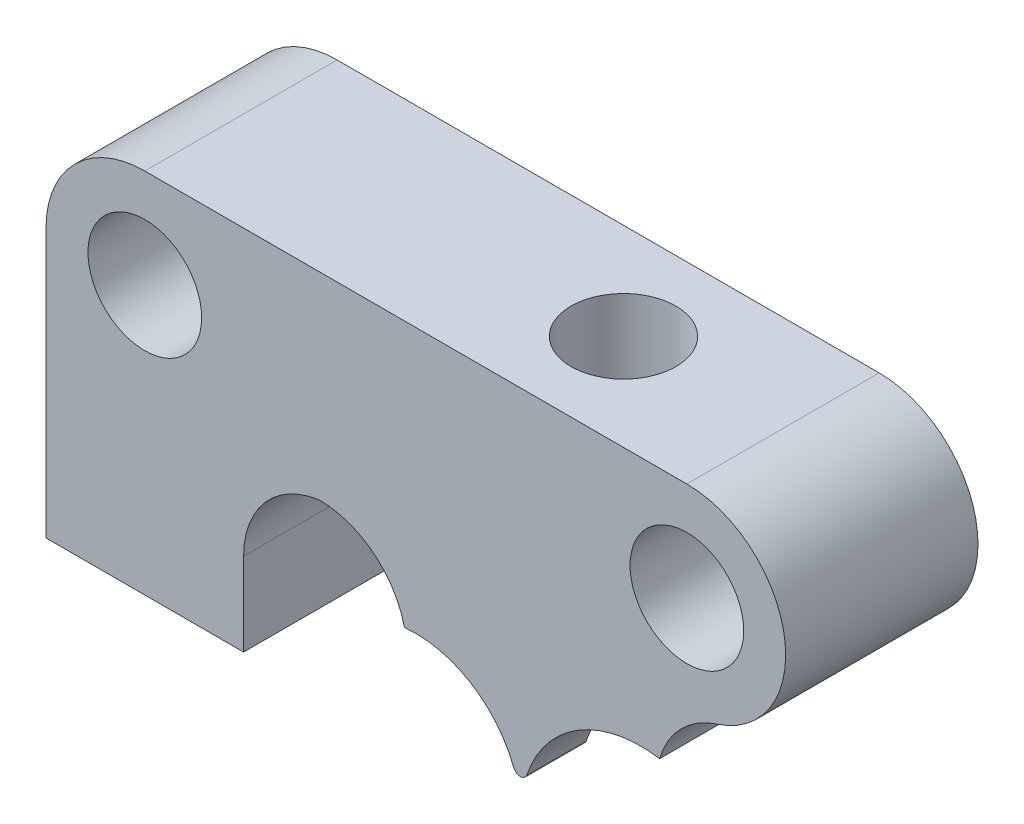
ISO-10303-21;
HEADER;
FILE_DESCRIPTION(('STEP AP214'),'2;1');
FILE_NAME('part.step','',(''),(''),'','','');
FILE_SCHEMA(('AUTOMOTIVE_DESIGN { 1 0 10303 214 1 1 1 1 }'));
ENDSEC;
DATA;
#1=APPLICATION_CONTEXT('core data for automotive mechanical design processes');
#2=APPLICATION_PROTOCOL_DEFINITION('international standard','automotive_design',2000,#1);
#3=PRODUCT_CONTEXT('',#1,'mechanical');
#4=PRODUCT('Part','Part','',(#3));
#5=PRODUCT_RELATED_PRODUCT_CATEGORY('part','',(#4));
#6=PRODUCT_DEFINITION_FORMATION('','',#4);
#7=PRODUCT_DEFINITION_CONTEXT('part definition',#1,'design');
#8=PRODUCT_DEFINITION('design','',#6,#7);
#9=PRODUCT_DEFINITION_SHAPE('','',#8);
#10=(LENGTH_UNIT() NAMED_UNIT(*) SI_UNIT(.MILLI.,.METRE.));
#11=(NAMED_UNIT(*) PLANE_ANGLE_UNIT() SI_UNIT($,.RADIAN.));
#12=(NAMED_UNIT(*) SI_UNIT($,.STERADIAN.) SOLID_ANGLE_UNIT());
#13=UNCERTAINTY_MEASURE_WITH_UNIT(LENGTH_MEASURE(1.E-05),#10,'distance_accuracy_value','');
#14=(GEOMETRIC_REPRESENTATION_CONTEXT(3) GLOBAL_UNCERTAINTY_ASSIGNED_CONTEXT((#13)) GLOBAL_UNIT_ASSIGNED_CONTEXT((#10,
#11,#12)) REPRESENTATION_CONTEXT('',''));
#15=CARTESIAN_POINT('',(0.,0.,0.));
#16=DIRECTION('',(0.,0.,1.));
#17=DIRECTION('',(1.,0.,0.));
#18=AXIS2_PLACEMENT_3D('',#15,#16,#17);
#19=CARTESIAN_POINT('',(15.5,0.,-5.5));
#20=DIRECTION('',(0.,0.,1.));
#21=DIRECTION('',(1.,0.,0.));
#22=AXIS2_PLACEMENT_3D('',#19,#20,#21);
#23=CYLINDRICAL_SURFACE('',#22,1.6);
#24=CARTESIAN_POINT('',(15.5,0.,-5.5));
#25=DIRECTION('',(0.,0.,1.));
#26=DIRECTION('',(-1.,0.,0.));
#27=AXIS2_PLACEMENT_3D('',#24,#25,#26);
#28=CIRCLE('',#27,1.6);
#29=CARTESIAN_POINT('',(13.9,0.,-5.5));
#30=VERTEX_POINT('',#29);
#31=EDGE_CURVE('E172',#30,#30,#28,.T.);
#32=ORIENTED_EDGE('',*,*,#31,.F.);
#33=EDGE_LOOP('',(#32));
#34=FACE_BOUND('',#33,.T.);
#35=CARTESIAN_POINT('',(15.5,0.,-2.5));
#36=DIRECTION('',(0.,0.,1.));
#37=DIRECTION('',(1.,0.,0.));
#38=AXIS2_PLACEMENT_3D('',#35,#36,#37);
#39=CIRCLE('',#38,1.6);
#40=CARTESIAN_POINT('',(17.1,0.,-2.5));
#41=VERTEX_POINT('',#40);
#42=EDGE_CURVE('E372',#41,#41,#39,.F.);
#43=ORIENTED_EDGE('',*,*,#42,.F.);
#44=EDGE_LOOP('',(#43));
#45=FACE_BOUND('',#44,.T.);
#46=ADVANCED_FACE('F35',(#34,#45),#23,.F.);
#47=CARTESIAN_POINT('',(-15.5,0.,-5.5));
#48=DIRECTION('',(0.,0.,1.));
#49=DIRECTION('',(1.,0.,0.));
#50=AXIS2_PLACEMENT_3D('',#47,#48,#49);
#51=CYLINDRICAL_SURFACE('',#50,1.6);
#52=CARTESIAN_POINT('',(-15.5,0.,-5.5));
#53=DIRECTION('',(0.,0.,1.));
#54=DIRECTION('',(1.,0.,0.));
#55=AXIS2_PLACEMENT_3D('',#52,#53,#54);
#56=CIRCLE('',#55,1.6);
#57=CARTESIAN_POINT('',(-13.9,0.,-5.5));
#58=VERTEX_POINT('',#57);
#59=EDGE_CURVE('E175',#58,#58,#56,.T.);
#60=ORIENTED_EDGE('',*,*,#59,.F.);
#61=EDGE_LOOP('',(#60));
#62=FACE_BOUND('',#61,.T.);
#63=CARTESIAN_POINT('',(-15.5,0.,-2.5));
#64=DIRECTION('',(0.,0.,1.));
#65=DIRECTION('',(1.,0.,0.));
#66=AXIS2_PLACEMENT_3D('',#63,#64,#65);
#67=CIRCLE('',#66,1.6);
#68=CARTESIAN_POINT('',(-13.9,0.,-2.5));
#69=VERTEX_POINT('',#68);
#70=EDGE_CURVE('E378',#69,#69,#67,.F.);
#71=ORIENTED_EDGE('',*,*,#70,.F.);
#72=EDGE_LOOP('',(#71));
#73=FACE_BOUND('',#72,.T.);
#74=ADVANCED_FACE('F271',(#62,#73),#51,.F.);
#75=CARTESIAN_POINT('',(5.97354085603113,-13.2028692589827,-23.103006673446));
#76=DIRECTION('',(0.,0.,1.));
#77=DIRECTION('',(1.,0.,0.));
#78=AXIS2_PLACEMENT_3D('',#75,#76,#77);
#79=CYLINDRICAL_SURFACE('',#78,0.4);
#80=CARTESIAN_POINT('',(5.60019455252918,-13.3464399302962,-1.95183926555686));
#81=CARTESIAN_POINT('',(5.608347715772,-13.3676811915095,-1.95507330052211));
#82=CARTESIAN_POINT('',(5.61829181817849,-13.388097082791,-1.95896476773846));
#83=CARTESIAN_POINT('',(5.64132435827622,-13.426776079711,-1.96770762235598));
#84=CARTESIAN_POINT('',(5.65440475108509,-13.4450445179356,-1.97255654825818));
#85=CARTESIAN_POINT('',(5.68330032621506,-13.4790183336808,-1.98287301812496));
#86=CARTESIAN_POINT('',(5.69911216958106,-13.4947267955079,-1.98833980402227));
#87=CARTESIAN_POINT('',(5.73306411015345,-13.5232799607954,-1.99955947295355));
#88=CARTESIAN_POINT('',(5.75120559950401,-13.536122939242,-2.00531252578478));
#89=CARTESIAN_POINT('',(5.79012642435731,-13.5590849058018,-2.0170154431616));
#90=CARTESIAN_POINT('',(5.81098170591194,-13.5690760828936,-2.02296409348674));
#91=CARTESIAN_POINT('',(5.8541853327466,-13.5853440208873,-2.03451510498206));
#92=CARTESIAN_POINT('',(5.87653363736439,-13.591620882902,-2.04011747557511));
#93=CARTESIAN_POINT('',(5.92213240931326,-13.6002300890079,-2.05072152260191));
#94=CARTESIAN_POINT('',(5.94538333109942,-13.6025604190215,-2.05572289111074));
#95=CARTESIAN_POINT('',(5.99209128503104,-13.6031204117898,-2.06493270002383));
#96=CARTESIAN_POINT('',(6.01554827080366,-13.6013509747446,-2.06914131427646));
#97=CARTESIAN_POINT('',(6.0611179422559,-13.5938231144565,-2.07653381085748));
#98=CARTESIAN_POINT('',(6.08324899175528,-13.5882057997674,-2.07974828356291));
#99=CARTESIAN_POINT('',(6.12632313147857,-13.573243498962,-2.08533727500704));
#100=CARTESIAN_POINT('',(6.14726648382025,-13.5638993390239,-2.08771197968806));
#101=CARTESIAN_POINT('',(6.1867607967648,-13.5420345074817,-2.09163808329146));
#102=CARTESIAN_POINT('',(6.20536112004586,-13.5296065181265,-2.09321000004595));
#103=CARTESIAN_POINT('',(6.24026345493022,-13.5017956585147,-2.09574638563841));
#104=CARTESIAN_POINT('',(6.25656456623487,-13.4864116363085,-2.09671061703575));
#105=CARTESIAN_POINT('',(6.28634406737617,-13.4531716909248,-2.09818070041755));
#106=CARTESIAN_POINT('',(6.29982916983322,-13.4353218185931,-2.09868765224675));
#107=CARTESIAN_POINT('',(6.32362098195122,-13.3976470108319,-2.09940538330142));
#108=CARTESIAN_POINT('',(6.33393347421165,-13.3778257569148,-2.09961670388799));
#109=CARTESIAN_POINT('',(6.34633717478432,-13.3482010832342,-2.09980753365186));
#110=CARTESIAN_POINT('',(6.34981014774181,-13.3389600473704,-2.09985060186055));
#111=CARTESIAN_POINT('',(6.35293170535355,-13.3296075067629,-2.09988404212504));
#112=B_SPLINE_CURVE_WITH_KNOTS('',3,(#80,#81,#82,#83,#84,#85,#86,#87,#88,#89,#90,#91,#92,#93,
#94,#95,#96,#97,#98,#99,#100,#101,#102,#103,#104,#105,#106,#107,#108,#109,#110,#111),
.UNSPECIFIED.,.F.,.F.,(4,2,2,2,2,2,2,2,2,2,2,2,2,2,2,4),(0.,0.0688020749817213,
0.137429519420797,0.205973659003121,0.274558951312234,0.345856575247001,0.417152258193158,
0.488484315305642,0.559800711276562,0.628632713045664,0.697449464402272,0.764406209252077,
0.831389099887829,0.898210450933966,0.964909277569956,0.994496744066015),.UNSPECIFIED.);
#113=CARTESIAN_POINT('',(5.60019455252918,-13.3464399302962,-1.95183926555686));
#114=VERTEX_POINT('',#113);
#115=CARTESIAN_POINT('',(6.35293170535355,-13.3296075067629,-2.09988404212504));
#116=VERTEX_POINT('',#115);
#117=EDGE_CURVE('E245',#114,#116,#112,.T.);
#118=ORIENTED_EDGE('',*,*,#117,.F.);
#119=DIRECTION('',(0.,0.,1.));
#120=VECTOR('',#119,1.);
#121=CARTESIAN_POINT('',(5.60019455252918,-13.3464399302962,-23.103006673446));
#122=LINE('',#121,#120);
#123=CARTESIAN_POINT('',(5.60019455252918,-13.3464399302962,-5.5));
#124=VERTEX_POINT('',#123);
#125=EDGE_CURVE('E190',#124,#114,#122,.T.);
#126=ORIENTED_EDGE('',*,*,#125,.F.);
#127=CARTESIAN_POINT('',(5.97354085603113,-13.2028692589827,-5.5));
#128=DIRECTION('',(0.,0.,1.));
#129=DIRECTION('',(1.,0.,0.));
#130=AXIS2_PLACEMENT_3D('',#127,#128,#129);
#131=CIRCLE('',#130,0.4);
#132=CARTESIAN_POINT('',(6.35293170535355,-13.3296075067629,-5.5));
#133=VERTEX_POINT('',#132);
#134=EDGE_CURVE('E199',#133,#124,#131,.F.);
#135=ORIENTED_EDGE('',*,*,#134,.F.);
#136=DIRECTION('',(0.,0.,1.));
#137=VECTOR('',#136,1.);
#138=CARTESIAN_POINT('',(6.35293170535355,-13.3296075067629,-23.103006673446));
#139=LINE('',#138,#137);
#140=EDGE_CURVE('E195',#116,#133,#139,.F.);
#141=ORIENTED_EDGE('',*,*,#140,.F.);
#142=EDGE_LOOP('',(#118,#126,#135,#141));
#143=FACE_BOUND('',#142,.T.);
#144=ADVANCED_FACE('F275',(#143),#79,.T.);
#145=CARTESIAN_POINT('',(-15.5,0.,-5.5));
#146=DIRECTION('',(0.,0.,1.));
#147=DIRECTION('',(1.,0.,0.));
#148=AXIS2_PLACEMENT_3D('',#145,#146,#147);
#149=CYLINDRICAL_SURFACE('',#148,5.65);
#150=DIRECTION('',(0.,0.,1.));
#151=VECTOR('',#150,1.);
#152=CARTESIAN_POINT('',(-21.15,0.,-24.5607581171369));
#153=LINE('',#152,#151);
#154=CARTESIAN_POINT('',(-21.15,0.,-5.5));
#155=VERTEX_POINT('',#154);
#156=CARTESIAN_POINT('',(-21.15,0.,5.5));
#157=VERTEX_POINT('',#156);
#158=EDGE_CURVE('E138',#155,#157,#153,.T.);
#159=ORIENTED_EDGE('',*,*,#158,.T.);
#160=CARTESIAN_POINT('',(-15.5,0.,5.5));
#161=DIRECTION('',(0.,0.,1.));
#162=DIRECTION('',(1.,0.,0.));
#163=AXIS2_PLACEMENT_3D('',#160,#161,#162);
#164=CIRCLE('',#163,5.65);
#165=CARTESIAN_POINT('',(-15.5,5.65,5.5));
#166=VERTEX_POINT('',#165);
#167=EDGE_CURVE('E152',#166,#157,#164,.T.);
#168=ORIENTED_EDGE('',*,*,#167,.F.);
#169=DIRECTION('',(0.,0.,1.));
#170=VECTOR('',#169,1.);
#171=CARTESIAN_POINT('',(-15.5,5.65,-5.5));
#172=LINE('',#171,#170);
#173=CARTESIAN_POINT('',(-15.5,5.65,-5.5));
#174=VERTEX_POINT('',#173);
#175=EDGE_CURVE('E185',#174,#166,#172,.T.);
#176=ORIENTED_EDGE('',*,*,#175,.F.);
#177=CARTESIAN_POINT('',(-15.5,0.,-5.5));
#178=DIRECTION('',(0.,0.,1.));
#179=DIRECTION('',(1.,0.,0.));
#180=AXIS2_PLACEMENT_3D('',#177,#178,#179);
#181=CIRCLE('',#180,5.65);
#182=EDGE_CURVE('E154',#174,#155,#181,.T.);
#183=ORIENTED_EDGE('',*,*,#182,.T.);
#184=EDGE_LOOP('',(#159,#168,#176,#183));
#185=FACE_BOUND('',#184,.T.);
#186=ADVANCED_FACE('F151',(#185),#149,.T.);
#187=CARTESIAN_POINT('',(-15.5,5.65,-5.5));
#188=DIRECTION('',(0.,1.,0.));
#189=DIRECTION('',(-1.,0.,0.));
#190=AXIS2_PLACEMENT_3D('',#187,#188,#189);
#191=PLANE('',#190);
#192=CARTESIAN_POINT('',(6.375,5.65,0.));
#193=DIRECTION('',(0.,1.,0.));
#194=DIRECTION('',(-1.,0.,0.));
#195=AXIS2_PLACEMENT_3D('',#192,#193,#194);
#196=CIRCLE('',#195,3.);
#197=CARTESIAN_POINT('',(3.375,5.65,0.));
#198=VERTEX_POINT('',#197);
#199=EDGE_CURVE('E167',#198,#198,#196,.T.);
#200=ORIENTED_EDGE('',*,*,#199,.F.);
#201=EDGE_LOOP('',(#200));
#202=FACE_BOUND('',#201,.T.);
#203=ORIENTED_EDGE('',*,*,#175,.T.);
#204=DIRECTION('',(-1.,0.,0.));
#205=VECTOR('',#204,1.);
#206=CARTESIAN_POINT('',(-15.5,5.65,5.5));
#207=LINE('',#206,#205);
#208=CARTESIAN_POINT('',(15.5,5.65,5.5));
#209=VERTEX_POINT('',#208);
#210=EDGE_CURVE('E161',#209,#166,#207,.T.);
#211=ORIENTED_EDGE('',*,*,#210,.F.);
#212=DIRECTION('',(0.,0.,1.));
#213=VECTOR('',#212,1.);
#214=CARTESIAN_POINT('',(15.5,5.65,-5.5));
#215=LINE('',#214,#213);
#216=CARTESIAN_POINT('',(15.5,5.65,-5.5));
#217=VERTEX_POINT('',#216);
#218=EDGE_CURVE('E184',#217,#209,#215,.T.);
#219=ORIENTED_EDGE('',*,*,#218,.F.);
#220=DIRECTION('',(-1.,0.,0.));
#221=VECTOR('',#220,1.);
#222=CARTESIAN_POINT('',(-15.5,5.65,-5.5));
#223=LINE('',#222,#221);
#224=EDGE_CURVE('E181',#217,#174,#223,.T.);
#225=ORIENTED_EDGE('',*,*,#224,.T.);
#226=EDGE_LOOP('',(#203,#211,#219,#225));
#227=FACE_BOUND('',#226,.T.);
#228=ADVANCED_FACE('F280',(#202,#227),#191,.T.);
#229=CARTESIAN_POINT('',(15.5,0.,-5.5));
#230=DIRECTION('',(0.,0.,1.));
#231=DIRECTION('',(1.,0.,0.));
#232=AXIS2_PLACEMENT_3D('',#229,#230,#231);
#233=CYLINDRICAL_SURFACE('',#232,5.65);
#234=CARTESIAN_POINT('',(15.5,0.,5.5));
#235=DIRECTION('',(0.,0.,1.));
#236=DIRECTION('',(1.,0.,0.));
#237=AXIS2_PLACEMENT_3D('',#234,#235,#236);
#238=CIRCLE('',#237,5.65);
#239=CARTESIAN_POINT('',(17.2169144549984,-5.38281569015858,5.5));
#240=VERTEX_POINT('',#239);
#241=EDGE_CURVE('E162',#240,#209,#238,.T.);
#242=ORIENTED_EDGE('',*,*,#241,.F.);
#243=DIRECTION('',(0.,0.,1.));
#244=VECTOR('',#243,1.);
#245=CARTESIAN_POINT('',(17.2169144549984,-5.38281569015859,-5.5));
#246=LINE('',#245,#244);
#247=CARTESIAN_POINT('',(17.2169144549984,-5.38281569015858,-5.5));
#248=VERTEX_POINT('',#247);
#249=EDGE_CURVE('E213',#240,#248,#246,.F.);
#250=ORIENTED_EDGE('',*,*,#249,.T.);
#251=CARTESIAN_POINT('',(15.5,0.,-5.5));
#252=DIRECTION('',(0.,0.,1.));
#253=DIRECTION('',(1.,0.,0.));
#254=AXIS2_PLACEMENT_3D('',#251,#252,#253);
#255=CIRCLE('',#254,5.65);
#256=EDGE_CURVE('E179',#248,#217,#255,.T.);
#257=ORIENTED_EDGE('',*,*,#256,.T.);
#258=ORIENTED_EDGE('',*,*,#218,.T.);
#259=EDGE_LOOP('',(#242,#250,#257,#258));
#260=FACE_BOUND('',#259,.T.);
#261=ADVANCED_FACE('F279',(#260),#233,.T.);
#262=CARTESIAN_POINT('',(-15.5,0.,-5.5));
#263=DIRECTION('',(0.,0.,1.));
#264=DIRECTION('',(1.,0.,0.));
#265=AXIS2_PLACEMENT_3D('',#262,#263,#264);
#266=PLANE('',#265);
#267=DIRECTION('',(0.,1.,0.));
#268=VECTOR('',#267,1.);
#269=CARTESIAN_POINT('',(-21.15,0.,-5.5));
#270=LINE('',#269,#268);
#271=CARTESIAN_POINT('',(-21.15,-15.35,-5.5));
#272=VERTEX_POINT('',#271);
#273=EDGE_CURVE('E349',#272,#155,#270,.T.);
#274=ORIENTED_EDGE('',*,*,#273,.T.);
#275=ORIENTED_EDGE('',*,*,#182,.F.);
#276=ORIENTED_EDGE('',*,*,#224,.F.);
#277=ORIENTED_EDGE('',*,*,#256,.F.);
#278=CARTESIAN_POINT('',(18.7363077780059,-10.1463693982635,-5.5));
#279=DIRECTION('',(0.,0.,1.));
#280=DIRECTION('',(1.,0.,0.));
#281=AXIS2_PLACEMENT_3D('',#278,#279,#280);
#282=CIRCLE('',#281,5.);
#283=CARTESIAN_POINT('',(13.9390151945711,-8.73711999914288,-5.5));
#284=VERTEX_POINT('',#283);
#285=EDGE_CURVE('E401',#248,#284,#282,.T.);
#286=ORIENTED_EDGE('',*,*,#285,.T.);
#287=CARTESIAN_POINT('',(12.85,-15.5,-5.5));
#288=DIRECTION('',(0.,0.,1.));
#289=DIRECTION('',(1.,0.,0.));
#290=AXIS2_PLACEMENT_3D('',#287,#288,#289);
#291=CIRCLE('',#290,6.85);
#292=EDGE_CURVE('E331',#284,#133,#291,.T.);
#293=ORIENTED_EDGE('',*,*,#292,.T.);
#294=ORIENTED_EDGE('',*,*,#134,.T.);
#295=CARTESIAN_POINT('',(0.,-15.5,-5.5));
#296=DIRECTION('',(0.,0.,1.));
#297=DIRECTION('',(1.,0.,0.));
#298=AXIS2_PLACEMENT_3D('',#295,#296,#297);
#299=CIRCLE('',#298,6.);
#300=CARTESIAN_POINT('',(-0.650136389581505,-9.53532711081807,-5.5));
#301=VERTEX_POINT('',#300);
#302=EDGE_CURVE('E329',#124,#301,#299,.T.);
#303=ORIENTED_EDGE('',*,*,#302,.T.);
#304=CARTESIAN_POINT('',(-5.52430343125363,-10.65,-5.5));
#305=DIRECTION('',(0.,0.,1.));
#306=DIRECTION('',(1.,0.,0.));
#307=AXIS2_PLACEMENT_3D('',#304,#305,#306);
#308=CIRCLE('',#307,5.);
#309=CARTESIAN_POINT('',(-5.52430343125363,-5.65,-5.5));
#310=VERTEX_POINT('',#309);
#311=EDGE_CURVE('E387',#301,#310,#308,.T.);
#312=ORIENTED_EDGE('',*,*,#311,.T.);
#313=CARTESIAN_POINT('',(-4.84999999999999,-10.6043228480388,-5.5));
#314=DIRECTION('',(0.,0.,1.));
#315=DIRECTION('',(1.,0.,0.));
#316=AXIS2_PLACEMENT_3D('',#313,#314,#315);
#317=CIRCLE('',#316,5.);
#318=CARTESIAN_POINT('',(-9.84999999999999,-10.6043228480388,-5.5));
#319=VERTEX_POINT('',#318);
#320=EDGE_CURVE('E12',#310,#319,#317,.T.);
#321=ORIENTED_EDGE('',*,*,#320,.T.);
#322=DIRECTION('',(0.,-1.,0.));
#323=VECTOR('',#322,1.);
#324=CARTESIAN_POINT('',(-9.84999999999999,0.,-5.5));
#325=LINE('',#324,#323);
#326=CARTESIAN_POINT('',(-9.84999999999999,-15.35,-5.5));
#327=VERTEX_POINT('',#326);
#328=EDGE_CURVE('E354',#319,#327,#325,.T.);
#329=ORIENTED_EDGE('',*,*,#328,.T.);
#330=DIRECTION('',(-1.,0.,0.));
#331=VECTOR('',#330,1.);
#332=CARTESIAN_POINT('',(0.,-15.35,-5.5));
#333=LINE('',#332,#331);
#334=EDGE_CURVE('E351',#327,#272,#333,.T.);
#335=ORIENTED_EDGE('',*,*,#334,.T.);
#336=EDGE_LOOP('',(#274,#275,#276,#277,#286,#293,#294,#303,#312,#321,#329,#335));
#337=FACE_BOUND('',#336,.T.);
#338=ORIENTED_EDGE('',*,*,#31,.T.);
#339=EDGE_LOOP('',(#338));
#340=FACE_BOUND('',#339,.T.);
#341=ORIENTED_EDGE('',*,*,#59,.T.);
#342=EDGE_LOOP('',(#341));
#343=FACE_BOUND('',#342,.T.);
#344=ADVANCED_FACE('F267',(#337,#340,#343),#266,.F.);
#345=CARTESIAN_POINT('',(-15.5,0.,5.5));
#346=DIRECTION('',(0.,0.,1.));
#347=DIRECTION('',(1.,0.,0.));
#348=AXIS2_PLACEMENT_3D('',#345,#346,#347);
#349=PLANE('',#348);
#350=CARTESIAN_POINT('',(15.5,0.,5.5));
#351=DIRECTION('',(0.,0.,1.));
#352=DIRECTION('',(1.,0.,0.));
#353=AXIS2_PLACEMENT_3D('',#350,#351,#352);
#354=CIRCLE('',#353,3.25);
#355=CARTESIAN_POINT('',(18.75,0.,5.5));
#356=VERTEX_POINT('',#355);
#357=EDGE_CURVE('E361',#356,#356,#354,.T.);
#358=ORIENTED_EDGE('',*,*,#357,.F.);
#359=EDGE_LOOP('',(#358));
#360=FACE_BOUND('',#359,.T.);
#361=CARTESIAN_POINT('',(-15.5,0.,5.5));
#362=DIRECTION('',(0.,0.,1.));
#363=DIRECTION('',(1.,0.,0.));
#364=AXIS2_PLACEMENT_3D('',#361,#362,#363);
#365=CIRCLE('',#364,3.25);
#366=CARTESIAN_POINT('',(-12.25,0.,5.5));
#367=VERTEX_POINT('',#366);
#368=EDGE_CURVE('E373',#367,#367,#365,.T.);
#369=ORIENTED_EDGE('',*,*,#368,.F.);
#370=EDGE_LOOP('',(#369));
#371=FACE_BOUND('',#370,.T.);
#372=CARTESIAN_POINT('',(0.,-15.5,5.5));
#373=DIRECTION('',(0.,0.,-1.));
#374=DIRECTION('',(-1.,0.,0.));
#375=AXIS2_PLACEMENT_3D('',#372,#373,#374);
#376=CIRCLE('',#375,6.);
#377=CARTESIAN_POINT('',(-0.650136389581505,-9.53532711081807,5.5));
#378=VERTEX_POINT('',#377);
#379=CARTESIAN_POINT('',(5.60019455252918,-13.3464399302962,5.5));
#380=VERTEX_POINT('',#379);
#381=EDGE_CURVE('E320',#378,#380,#376,.T.);
#382=ORIENTED_EDGE('',*,*,#381,.T.);
#383=CARTESIAN_POINT('',(5.97354085603113,-13.2028692589827,5.5));
#384=DIRECTION('',(0.,0.,1.));
#385=DIRECTION('',(1.,0.,0.));
#386=AXIS2_PLACEMENT_3D('',#383,#384,#385);
#387=CIRCLE('',#386,0.4);
#388=CARTESIAN_POINT('',(6.35293170535355,-13.3296075067629,5.5));
#389=VERTEX_POINT('',#388);
#390=EDGE_CURVE('E193',#380,#389,#387,.T.);
#391=ORIENTED_EDGE('',*,*,#390,.T.);
#392=CARTESIAN_POINT('',(12.85,-15.5,5.5));
#393=DIRECTION('',(0.,0.,-1.));
#394=DIRECTION('',(-1.,0.,0.));
#395=AXIS2_PLACEMENT_3D('',#392,#393,#394);
#396=CIRCLE('',#395,6.85);
#397=CARTESIAN_POINT('',(13.9390151945711,-8.73711999914288,5.5));
#398=VERTEX_POINT('',#397);
#399=EDGE_CURVE('E316',#389,#398,#396,.T.);
#400=ORIENTED_EDGE('',*,*,#399,.T.);
#401=CARTESIAN_POINT('',(18.7363077780059,-10.1463693982635,5.5));
#402=DIRECTION('',(0.,0.,1.));
#403=DIRECTION('',(1.,0.,0.));
#404=AXIS2_PLACEMENT_3D('',#401,#402,#403);
#405=CIRCLE('',#404,5.);
#406=EDGE_CURVE('E402',#398,#240,#405,.F.);
#407=ORIENTED_EDGE('',*,*,#406,.T.);
#408=ORIENTED_EDGE('',*,*,#241,.T.);
#409=ORIENTED_EDGE('',*,*,#210,.T.);
#410=ORIENTED_EDGE('',*,*,#167,.T.);
#411=DIRECTION('',(0.,-1.,0.));
#412=VECTOR('',#411,1.);
#413=CARTESIAN_POINT('',(-21.15,0.,5.5));
#414=LINE('',#413,#412);
#415=CARTESIAN_POINT('',(-21.15,-15.35,5.5));
#416=VERTEX_POINT('',#415);
#417=EDGE_CURVE('E134',#157,#416,#414,.T.);
#418=ORIENTED_EDGE('',*,*,#417,.T.);
#419=DIRECTION('',(1.,0.,0.));
#420=VECTOR('',#419,1.);
#421=CARTESIAN_POINT('',(0.,-15.35,5.5));
#422=LINE('',#421,#420);
#423=CARTESIAN_POINT('',(-9.84999999999999,-15.35,5.5));
#424=VERTEX_POINT('',#423);
#425=EDGE_CURVE('E146',#416,#424,#422,.T.);
#426=ORIENTED_EDGE('',*,*,#425,.T.);
#427=DIRECTION('',(0.,1.,0.));
#428=VECTOR('',#427,1.);
#429=CARTESIAN_POINT('',(-9.84999999999999,0.,5.5));
#430=LINE('',#429,#428);
#431=CARTESIAN_POINT('',(-9.84999999999999,-10.6043228480388,5.5));
#432=VERTEX_POINT('',#431);
#433=EDGE_CURVE('E155',#424,#432,#430,.T.);
#434=ORIENTED_EDGE('',*,*,#433,.T.);
#435=CARTESIAN_POINT('',(-4.84999999999999,-10.6043228480388,5.5));
#436=DIRECTION('',(0.,0.,1.));
#437=DIRECTION('',(1.,0.,0.));
#438=AXIS2_PLACEMENT_3D('',#435,#436,#437);
#439=CIRCLE('',#438,5.);
#440=CARTESIAN_POINT('',(-5.52430343125363,-5.65,5.5));
#441=VERTEX_POINT('',#440);
#442=EDGE_CURVE('E43',#432,#441,#439,.F.);
#443=ORIENTED_EDGE('',*,*,#442,.T.);
#444=CARTESIAN_POINT('',(-5.52430343125363,-10.65,5.5));
#445=DIRECTION('',(0.,0.,1.));
#446=DIRECTION('',(1.,0.,0.));
#447=AXIS2_PLACEMENT_3D('',#444,#445,#446);
#448=CIRCLE('',#447,5.);
#449=EDGE_CURVE('E393',#441,#378,#448,.F.);
#450=ORIENTED_EDGE('',*,*,#449,.T.);
#451=EDGE_LOOP('',(#382,#391,#400,#407,#408,#409,#410,#418,#426,#434,#443,#450));
#452=FACE_BOUND('',#451,.T.);
#453=ADVANCED_FACE('F159',(#360,#371,#452),#349,.T.);
#454=CARTESIAN_POINT('',(6.375,0.65,0.));
#455=DIRECTION('',(0.,1.,0.));
#456=DIRECTION('',(-1.,0.,0.));
#457=AXIS2_PLACEMENT_3D('',#454,#455,#456);
#458=CYLINDRICAL_SURFACE('',#457,3.);
#459=CARTESIAN_POINT('',(6.375,0.65,0.));
#460=DIRECTION('',(0.,1.,0.));
#461=DIRECTION('',(-1.,0.,0.));
#462=AXIS2_PLACEMENT_3D('',#459,#460,#461);
#463=CIRCLE('',#462,3.);
#464=CARTESIAN_POINT('',(3.375,0.65,0.));
#465=VERTEX_POINT('',#464);
#466=EDGE_CURVE('E163',#465,#465,#463,.T.);
#467=ORIENTED_EDGE('',*,*,#466,.F.);
#468=EDGE_LOOP('',(#467));
#469=FACE_BOUND('',#468,.T.);
#470=ORIENTED_EDGE('',*,*,#199,.T.);
#471=EDGE_LOOP('',(#470));
#472=FACE_BOUND('',#471,.T.);
#473=ADVANCED_FACE('F260',(#469,#472),#458,.F.);
#474=CARTESIAN_POINT('',(6.375,0.65,0.));
#475=DIRECTION('',(0.,1.,0.));
#476=DIRECTION('',(-1.,0.,0.));
#477=AXIS2_PLACEMENT_3D('',#474,#475,#476);
#478=PLANE('',#477);
#479=CARTESIAN_POINT('',(6.375,0.65,0.));
#480=DIRECTION('',(0.,1.,0.));
#481=DIRECTION('',(-1.,0.,0.));
#482=AXIS2_PLACEMENT_3D('',#479,#480,#481);
#483=CIRCLE('',#482,0.95);
#484=CARTESIAN_POINT('',(5.425,0.649999999999999,0.));
#485=VERTEX_POINT('',#484);
#486=EDGE_CURVE('E324',#485,#485,#483,.T.);
#487=ORIENTED_EDGE('',*,*,#486,.F.);
#488=EDGE_LOOP('',(#487));
#489=FACE_BOUND('',#488,.T.);
#490=ORIENTED_EDGE('',*,*,#466,.T.);
#491=EDGE_LOOP('',(#490));
#492=FACE_BOUND('',#491,.T.);
#493=ADVANCED_FACE('F255',(#489,#492),#478,.T.);
#494=CARTESIAN_POINT('',(0.,-15.5,-23.103006673446));
#495=DIRECTION('',(0.,0.,1.));
#496=DIRECTION('',(1.,0.,0.));
#497=AXIS2_PLACEMENT_3D('',#494,#495,#496);
#498=CYLINDRICAL_SURFACE('',#497,6.);
#499=CARTESIAN_POINT('',(5.60019455252918,-13.3464399302962,1.95183926555686));
#500=CARTESIAN_POINT('',(5.5807249600577,-13.295808987317,1.94410823472759));
#501=CARTESIAN_POINT('',(5.5605988670132,-13.2455241752105,1.93578429885447));
#502=CARTESIAN_POINT('',(5.51908025838827,-13.1457112963829,1.917789130673));
#503=CARTESIAN_POINT('',(5.49768745672673,-13.0961834038113,1.9081175933417));
#504=CARTESIAN_POINT('',(5.43152898561603,-12.9485008854855,1.87676731811303));
#505=CARTESIAN_POINT('',(5.3849288154,-12.8516252242922,1.8528080124504));
#506=CARTESIAN_POINT('',(5.28683667334973,-12.6608048555584,1.79697855573533));
#507=CARTESIAN_POINT('',(5.23528329891555,-12.5669234523681,1.76499818585172));
#508=CARTESIAN_POINT('',(5.12907283148057,-12.3849262456802,1.69169146794275));
#509=CARTESIAN_POINT('',(5.07442177815938,-12.2967998977817,1.65038286791067));
#510=CARTESIAN_POINT('',(4.96009220807071,-12.1222756056204,1.55370150125076));
#511=CARTESIAN_POINT('',(4.900313571287,-12.036334246376,1.49760808319254));
#512=CARTESIAN_POINT('',(4.78222206932678,-11.8750478379493,1.37130508551637));
#513=CARTESIAN_POINT('',(4.72390342200975,-11.799652539798,1.30116660933404));
#514=CARTESIAN_POINT('',(4.62081139716186,-11.6719696905705,1.15733702563733));
#515=CARTESIAN_POINT('',(4.57531729083565,-11.6179125153812,1.08575000771934));
#516=CARTESIAN_POINT('',(4.49101418042913,-11.5206859771638,0.931819360601692));
#517=CARTESIAN_POINT('',(4.45220898499471,-11.4775228107017,0.849469649765282));
#518=CARTESIAN_POINT('',(4.38417430729011,-11.4034667337416,0.674867778221855));
#519=CARTESIAN_POINT('',(4.35501818435943,-11.3726674625213,0.58254652896732));
#520=CARTESIAN_POINT('',(4.30945915460723,-11.3251140149703,0.391365495523074));
#521=CARTESIAN_POINT('',(4.29304533618556,-11.3083478207502,0.292511384512188));
#522=CARTESIAN_POINT('',(4.2758658256634,-11.2908326800376,0.105833516663206));
#523=CARTESIAN_POINT('',(4.27326932514139,-11.2882090893397,0.018346942429282));
#524=CARTESIAN_POINT('',(4.27898311550852,-11.2940133994065,-0.155880339820197));
#525=CARTESIAN_POINT('',(4.28728939654763,-11.3024372371218,-0.242621310248155));
#526=CARTESIAN_POINT('',(4.31352195759299,-11.3294060943775,-0.408722479496125));
#527=CARTESIAN_POINT('',(4.33098134965716,-11.3474605880607,-0.488238221009338));
#528=CARTESIAN_POINT('',(4.37402070682487,-11.3928215461766,-0.642244701618418));
#529=CARTESIAN_POINT('',(4.39960135283205,-11.4201287863928,-0.716735018736553));
#530=CARTESIAN_POINT('',(4.4589271135698,-11.4850285484386,-0.863286613604367));
#531=CARTESIAN_POINT('',(4.49305129986278,-11.523114251242,-0.934974011467418));
#532=CARTESIAN_POINT('',(4.56651820949985,-11.6076926315508,-1.07019999719645));
#533=CARTESIAN_POINT('',(4.60586311532634,-11.6541888279683,-1.1337351551104));
#534=CARTESIAN_POINT('',(4.70654141428023,-11.7774586850735,-1.27956649149858));
#535=CARTESIAN_POINT('',(4.76969441387106,-11.8583479696922,-1.35713351040969));
#536=CARTESIAN_POINT('',(4.89767033514051,-12.0323581843029,-1.49547234475733));
#537=CARTESIAN_POINT('',(4.96249709920114,-12.1255097328298,-1.55620089520809));
#538=CARTESIAN_POINT('',(5.07321721166418,-12.2953300408542,-1.64897255314107));
#539=CARTESIAN_POINT('',(5.11961119807032,-12.3699016259358,-1.68436050035696));
#540=CARTESIAN_POINT('',(5.21025437483633,-12.5232270606301,-1.74826959328712));
#541=CARTESIAN_POINT('',(5.25450227230737,-12.6019833728679,-1.77678663975106));
#542=CARTESIAN_POINT('',(5.34008141674755,-12.7628771918096,-1.82795752960625));
#543=CARTESIAN_POINT('',(5.38141267870065,-12.8450146811397,-1.85061140312063));
#544=CARTESIAN_POINT('',(5.46064407511862,-13.0120478945966,-1.891012919249));
#545=CARTESIAN_POINT('',(5.49854578674289,-13.0969423262186,-1.90876282485879));
#546=CARTESIAN_POINT('',(5.54588756606664,-13.2100233330899,-1.92943628123288));
#547=CARTESIAN_POINT('',(5.55702676197155,-13.2371880289352,-1.93418206102943));
#548=CARTESIAN_POINT('',(5.57890561804872,-13.291681237829,-1.94328950164357));
#549=CARTESIAN_POINT('',(5.58964598864224,-13.3190093478828,-1.94765186646368));
#550=CARTESIAN_POINT('',(5.60019455252919,-13.3464399302962,-1.95183926555698));
#551=B_SPLINE_CURVE_WITH_KNOTS('',3,(#499,#500,#501,#502,#503,#504,#505,#506,#507,#508,#509,
#510,#511,#512,#513,#514,#515,#516,#517,#518,#519,#520,#521,#522,#523,#524,#525,#526,#527,#528,
#529,#530,#531,#532,#533,#534,#535,#536,#537,#538,#539,#540,#541,#542,#543,#544,#545,#546,#547,
#548,#549,#550),.UNSPECIFIED.,.F.,.F.,(4,2,2,2,2,2,2,2,2,2,2,2,2,2,2,2,2,2,2,2,2,2,2,2,2,4),(0.,
0.164364375966333,0.328766015617755,0.658792030163756,0.993628537643197,1.32783327025367,
1.68303872430693,2.0364894460765,2.33702210080343,2.637725316677,2.94066481750665,
3.24334461553571,3.50469058025461,3.76594045348154,4.01500204814372,4.26408453019062,
4.52721368541281,4.7904531883985,5.17421844889587,5.55896081145088,5.84264683069398,
6.12650168316235,6.4103550772454,6.69407726409867,6.78329671443823,6.87234876533797),.UNSPECIFIED.);
#552=CARTESIAN_POINT('',(5.60019455252918,-13.3464399302962,1.95183926555686));
#553=VERTEX_POINT('',#552);
#554=EDGE_CURVE('E240',#553,#114,#551,.T.);
#555=ORIENTED_EDGE('',*,*,#554,.F.);
#556=EDGE_CURVE('E187',#553,#380,#122,.T.);
#557=ORIENTED_EDGE('',*,*,#556,.T.);
#558=ORIENTED_EDGE('',*,*,#381,.F.);
#559=DIRECTION('',(0.,0.,1.));
#560=VECTOR('',#559,1.);
#561=CARTESIAN_POINT('',(-0.650136389581505,-9.53532711081807,-23.103006673446));
#562=LINE('',#561,#560);
#563=EDGE_CURVE('E322',#301,#378,#562,.T.);
#564=ORIENTED_EDGE('',*,*,#563,.F.);
#565=ORIENTED_EDGE('',*,*,#302,.F.);
#566=ORIENTED_EDGE('',*,*,#125,.T.);
#567=EDGE_LOOP('',(#555,#557,#558,#564,#565,#566));
#568=FACE_BOUND('',#567,.T.);
#569=ADVANCED_FACE('F250',(#568),#498,.F.);
#570=CARTESIAN_POINT('',(12.85,-15.5,-23.103006673446));
#571=DIRECTION('',(0.,0.,1.));
#572=DIRECTION('',(1.,0.,0.));
#573=AXIS2_PLACEMENT_3D('',#570,#571,#572);
#574=CYLINDRICAL_SURFACE('',#573,6.85);
#575=CARTESIAN_POINT('',(6.35293170535355,-13.3296075067629,-2.09988404212504));
#576=CARTESIAN_POINT('',(6.37907714246061,-13.2513420600247,-2.1001540865466));
#577=CARTESIAN_POINT('',(6.40663491436668,-13.1735544343757,-2.09996053664631));
#578=CARTESIAN_POINT('',(6.46454495020782,-13.019016529654,-2.09829093787775));
#579=CARTESIAN_POINT('',(6.49489799459971,-12.942266547199,-2.0968145298513));
#580=CARTESIAN_POINT('',(6.59042812311099,-12.7129291399987,-2.08990269397807));
#581=CARTESIAN_POINT('',(6.659789879042,-12.5621116976914,-2.08197384000479));
#582=CARTESIAN_POINT('',(6.81010395530011,-12.2641932615521,-2.05587035042508));
#583=CARTESIAN_POINT('',(6.89122408786063,-12.1171904494171,-2.03753368433504));
#584=CARTESIAN_POINT('',(7.06266554391648,-11.8316470918069,-1.98622697333508));
#585=CARTESIAN_POINT('',(7.15295961421007,-11.6930833305733,-1.95329934801217));
#586=CARTESIAN_POINT('',(7.28575959153987,-11.5042002021428,-1.89271421052346));
#587=CARTESIAN_POINT('',(7.32557312128558,-11.4493559662832,-1.87309687424775));
#588=CARTESIAN_POINT('',(7.40604764857712,-11.3418282199533,-1.83003411515653));
#589=CARTESIAN_POINT('',(7.44670870532059,-11.2891448611826,-1.80658842415316));
#590=CARTESIAN_POINT('',(7.56915017265795,-11.1351149812838,-1.73010328817965));
#591=CARTESIAN_POINT('',(7.65169552398453,-11.037355878562,-1.6707841955009));
#592=CARTESIAN_POINT('',(7.81581171011341,-10.8529737867917,-1.53158292170029));
#593=CARTESIAN_POINT('',(7.8973524938521,-10.7665268295589,-1.45142316942318));
#594=CARTESIAN_POINT('',(8.0131684138548,-10.6491619259568,-1.31527964396456));
#595=CARTESIAN_POINT('',(8.05068601164168,-10.6120958740083,-1.26725625651603));
#596=CARTESIAN_POINT('',(8.12266896736819,-10.5424465612498,-1.16598041299126));
#597=CARTESIAN_POINT('',(8.15713583708244,-10.5098610756338,-1.11273057476297));
#598=CARTESIAN_POINT('',(8.23441882444715,-10.4381176950171,-0.980035480357506));
#599=CARTESIAN_POINT('',(8.27544196104817,-10.4011560867039,-0.898316197050816));
#600=CARTESIAN_POINT('',(8.34739600677849,-10.3375024110092,-0.726837973833774));
#601=CARTESIAN_POINT('',(8.37833142257528,-10.310805756824,-0.637082646913772));
#602=CARTESIAN_POINT('',(8.42816964496319,-10.2682692914031,-0.45140216084568));
#603=CARTESIAN_POINT('',(8.44702532225906,-10.252471985937,-0.35545442419338));
#604=CARTESIAN_POINT('',(8.47113994651157,-10.2323305005004,-0.160683439923067));
#605=CARTESIAN_POINT('',(8.47640155995381,-10.2279840744283,-0.0618607600736364));
#606=CARTESIAN_POINT('',(8.47307181338638,-10.2307501023127,0.128691107766412));
#607=CARTESIAN_POINT('',(8.4653905055555,-10.2371097541223,0.220449344253559));
#608=CARTESIAN_POINT('',(8.43838515731881,-10.2597270349996,0.400958527412137));
#609=CARTESIAN_POINT('',(8.41906272308273,-10.275983298598,0.489709887169614));
#610=CARTESIAN_POINT('',(8.36996579371859,-10.3180286553653,0.661918805981577));
#611=CARTESIAN_POINT('',(8.34018606380657,-10.3438225232761,0.74537368893927));
#612=CARTESIAN_POINT('',(8.27191289340316,-10.4043457056194,0.905138852445));
#613=CARTESIAN_POINT('',(8.23341773403348,-10.439076782855,0.981447719435958));
#614=CARTESIAN_POINT('',(8.14638996764601,-10.5198060783369,1.13149817223893));
#615=CARTESIAN_POINT('',(8.09730179673697,-10.566481825629,1.20455003198533));
#616=CARTESIAN_POINT('',(7.99389901961156,-10.6682235926323,1.34032268023582));
#617=CARTESIAN_POINT('',(7.93958171719835,-10.7232939493246,1.40303809347137));
#618=CARTESIAN_POINT('',(7.80046839004312,-10.8697442285521,1.54673631253296));
#619=CARTESIAN_POINT('',(7.71388130256221,-10.9656140803649,1.62141946204768));
#620=CARTESIAN_POINT('',(7.54039794297219,-11.1700236600358,1.75031387963923));
#621=CARTESIAN_POINT('',(7.45350141033635,-11.2785908986059,1.80447957657772));
#622=CARTESIAN_POINT('',(7.30468678521586,-11.4771410762038,1.88439018783228));
#623=CARTESIAN_POINT('',(7.24192016753157,-11.5650524041755,1.91385218970349));
#624=CARTESIAN_POINT('',(7.11961226496615,-11.7453992855724,1.96467371920782));
#625=CARTESIAN_POINT('',(7.06007286932278,-11.837837430029,1.98602854383515));
#626=CARTESIAN_POINT('',(6.9448696712301,-12.0266435882005,2.02210309603636));
#627=CARTESIAN_POINT('',(6.88921598661669,-12.1230208959635,2.03680601076482));
#628=CARTESIAN_POINT('',(6.7824459313063,-12.3188480455121,2.06082004712277));
#629=CARTESIAN_POINT('',(6.73132836558992,-12.4182970687059,2.0701325924118));
#630=CARTESIAN_POINT('',(6.61898278122795,-12.6507369279724,2.08677223929883));
#631=CARTESIAN_POINT('',(6.5594607278721,-12.7846623501637,2.09261497509409));
#632=CARTESIAN_POINT('',(6.47690260558508,-12.9877445041018,2.09770467386792));
#633=CARTESIAN_POINT('',(6.45058662960667,-13.0555569008655,2.09879144027849));
#634=CARTESIAN_POINT('',(6.40012534377627,-13.191991394043,2.1000008978348));
#635=CARTESIAN_POINT('',(6.37597997091712,-13.2606134668883,2.10012361697336));
#636=CARTESIAN_POINT('',(6.35293170535355,-13.3296075067629,2.09988404212504));
#637=B_SPLINE_CURVE_WITH_KNOTS('',3,(#575,#576,#577,#578,#579,#580,#581,#582,#583,#584,#585,
#586,#587,#588,#589,#590,#591,#592,#593,#594,#595,#596,#597,#598,#599,#600,#601,#602,#603,#604,
#605,#606,#607,#608,#609,#610,#611,#612,#613,#614,#615,#616,#617,#618,#619,#620,#621,#622,#623,
#624,#625,#626,#627,#628,#629,#630,#631,#632,#633,#634,#635,#636),.UNSPECIFIED.,.F.,.F.,(4,2,2,
2,2,2,2,2,2,2,2,2,2,2,2,2,2,2,2,2,2,2,2,2,2,2,2,2,2,2,4),(0.,0.247520516696163,
0.495110353351539,0.992994379765745,1.498850916893,2.00324635325428,2.21478641860069,
2.42634130933331,2.84782482733905,3.27523843103634,3.48888083206079,3.70241676379289,
3.99696072211277,4.29137291270245,4.58692687221299,4.88242285419466,5.15799647137053,
5.43353207532885,5.70920580585535,5.98493395286289,6.28264498754831,6.5805103559023,
7.02565017684422,7.47177297616175,7.8072168772774,8.14285507446871,8.47933692893193,
8.81572987400845,9.25527035284775,9.47347940562091,9.69168212228678),.UNSPECIFIED.);
#638=CARTESIAN_POINT('',(6.35293170535355,-13.3296075067629,2.09988404212504));
#639=VERTEX_POINT('',#638);
#640=EDGE_CURVE('E205',#116,#639,#637,.T.);
#641=ORIENTED_EDGE('',*,*,#640,.F.);
#642=ORIENTED_EDGE('',*,*,#140,.T.);
#643=ORIENTED_EDGE('',*,*,#292,.F.);
#644=DIRECTION('',(0.,0.,1.));
#645=VECTOR('',#644,1.);
#646=CARTESIAN_POINT('',(13.9390151945711,-8.73711999914288,-23.103006673446));
#647=LINE('',#646,#645);
#648=EDGE_CURVE('E319',#284,#398,#647,.T.);
#649=ORIENTED_EDGE('',*,*,#648,.T.);
#650=ORIENTED_EDGE('',*,*,#399,.F.);
#651=EDGE_CURVE('E196',#389,#639,#139,.F.);
#652=ORIENTED_EDGE('',*,*,#651,.T.);
#653=EDGE_LOOP('',(#641,#642,#643,#649,#650,#652));
#654=FACE_BOUND('',#653,.T.);
#655=ADVANCED_FACE('F254',(#654),#574,.F.);
#656=CARTESIAN_POINT('',(6.35293170535355,-13.3296075067629,2.09988404212504));
#657=CARTESIAN_POINT('',(6.3458445340523,-13.3508843794541,2.09980438396467));
#658=CARTESIAN_POINT('',(6.33693411280312,-13.3715474683532,2.09968027808138));
#659=CARTESIAN_POINT('',(6.31580157912601,-13.4110895303678,2.09919333864354));
#660=CARTESIAN_POINT('',(6.30358103251168,-13.4299693413601,2.0988306178472));
#661=CARTESIAN_POINT('',(6.2761471892012,-13.4654204763664,2.09771647693716));
#662=CARTESIAN_POINT('',(6.26093203106645,-13.481990353535,2.09696481458311));
#663=CARTESIAN_POINT('',(6.22796996357857,-13.5123318727186,2.09491159551496));
#664=CARTESIAN_POINT('',(6.21022391997309,-13.526104467719,2.09361022654324));
#665=CARTESIAN_POINT('',(6.17281458852653,-13.5504109746416,2.09032802328737));
#666=CARTESIAN_POINT('',(6.15316082001035,-13.5609599774719,2.08835044981213));
#667=CARTESIAN_POINT('',(6.11245224862724,-13.5786298707302,2.08362381912577));
#668=CARTESIAN_POINT('',(6.09139725368087,-13.5857502900634,2.08087465597864));
#669=CARTESIAN_POINT('',(6.04855148974262,-13.5963916728996,2.07458409925645));
#670=CARTESIAN_POINT('',(6.02676203626247,-13.5999187519325,2.07104406423711));
#671=CARTESIAN_POINT('',(5.9830360505968,-13.6033576374552,2.06321537704059));
#672=CARTESIAN_POINT('',(5.96109951464405,-13.6032693509879,2.05892670561753));
#673=CARTESIAN_POINT('',(5.91725317186479,-13.5995115090463,2.049629140446));
#674=CARTESIAN_POINT('',(5.89535182571194,-13.5957738011918,2.04460808886369));
#675=CARTESIAN_POINT('',(5.85257031812003,-13.5847778984342,2.03409758455647));
#676=CARTESIAN_POINT('',(5.83169032144952,-13.577519137548,2.02860805664441));
#677=CARTESIAN_POINT('',(5.79073318784253,-13.5593812459662,2.01720111128056));
#678=CARTESIAN_POINT('',(5.77071164865363,-13.5483816813853,2.01127540955539));
#679=CARTESIAN_POINT('',(5.73279922531454,-13.5231232459158,1.99949320255531));
#680=CARTESIAN_POINT('',(5.71490975702277,-13.5088622273156,1.99363674556359));
#681=CARTESIAN_POINT('',(5.68142680169703,-13.4771176057188,1.98223993884715));
#682=CARTESIAN_POINT('',(5.6658844301805,-13.4595769942435,1.97670789678212));
#683=CARTESIAN_POINT('',(5.6380364586008,-13.4219179384215,1.96649577582992));
#684=CARTESIAN_POINT('',(5.6257232884896,-13.4018056904535,1.96181371246564));
#685=CARTESIAN_POINT('',(5.6097026941405,-13.3695378306127,1.95559560355767));
#686=CARTESIAN_POINT('',(5.60467639762853,-13.3581068709444,1.95361766836237));
#687=CARTESIAN_POINT('',(5.60019455252917,-13.3464399302962,1.95183926555686));
#688=B_SPLINE_CURVE_WITH_KNOTS('',3,(#656,#657,#658,#659,#660,#661,#662,#663,#664,#665,#666,
#667,#668,#669,#670,#671,#672,#673,#674,#675,#676,#677,#678,#679,#680,#681,#682,#683,#684,#685,
#686,#687),.UNSPECIFIED.,.F.,.F.,(4,2,2,2,2,2,2,2,2,2,2,2,2,2,2,4),(0.,0.0671922181710152,
0.134352707240901,0.201555075605503,0.268734510746204,0.335594456465263,0.402463586267331,
0.469218719971181,0.535975570061362,0.604003415051858,0.672042198639015,0.742519574544968,
0.813043495078565,0.884931818901677,0.956650081034027,0.994520591935837),.UNSPECIFIED.);
#689=EDGE_CURVE('E201',#639,#553,#688,.T.);
#690=ORIENTED_EDGE('',*,*,#689,.F.);
#691=ORIENTED_EDGE('',*,*,#651,.F.);
#692=ORIENTED_EDGE('',*,*,#390,.F.);
#693=ORIENTED_EDGE('',*,*,#556,.F.);
#694=EDGE_LOOP('',(#690,#691,#692,#693));
#695=FACE_BOUND('',#694,.T.);
#696=ADVANCED_FACE('F215',(#695),#79,.T.);
#697=CARTESIAN_POINT('',(6.375,-13.6028692589827,0.));
#698=DIRECTION('',(0.,1.,0.));
#699=DIRECTION('',(-1.,0.,0.));
#700=AXIS2_PLACEMENT_3D('',#697,#698,#699);
#701=CYLINDRICAL_SURFACE('',#700,0.95);
#702=CARTESIAN_POINT('',(6.375,-3.32960750676292,0.));
#703=DIRECTION('',(0.,1.,0.));
#704=DIRECTION('',(-1.,0.,0.));
#705=AXIS2_PLACEMENT_3D('',#702,#703,#704);
#706=CIRCLE('',#705,0.95);
#707=CARTESIAN_POINT('',(5.425,-3.32960750676292,0.));
#708=VERTEX_POINT('',#707);
#709=EDGE_CURVE('E202',#708,#708,#706,.F.);
#710=ORIENTED_EDGE('',*,*,#709,.T.);
#711=EDGE_LOOP('',(#710));
#712=FACE_BOUND('',#711,.T.);
#713=ORIENTED_EDGE('',*,*,#486,.T.);
#714=EDGE_LOOP('',(#713));
#715=FACE_BOUND('',#714,.T.);
#716=ADVANCED_FACE('F228',(#712,#715),#701,.F.);
#717=CARTESIAN_POINT('',(6.375,-3.32960750676292,0.));
#718=DIRECTION('',(0.,1.,0.));
#719=DIRECTION('',(-1.,0.,0.));
#720=AXIS2_PLACEMENT_3D('',#717,#718,#719);
#721=PLANE('',#720);
#722=CARTESIAN_POINT('',(6.375,-3.32960750676292,0.));
#723=DIRECTION('',(0.,1.,0.));
#724=DIRECTION('',(-1.,0.,0.));
#725=AXIS2_PLACEMENT_3D('',#722,#723,#724);
#726=CIRCLE('',#725,2.1);
#727=CARTESIAN_POINT('',(4.275,-3.32960750676292,0.));
#728=VERTEX_POINT('',#727);
#729=EDGE_CURVE('E206',#728,#728,#726,.T.);
#730=ORIENTED_EDGE('',*,*,#729,.F.);
#731=EDGE_LOOP('',(#730));
#732=FACE_BOUND('',#731,.T.);
#733=ORIENTED_EDGE('',*,*,#709,.F.);
#734=EDGE_LOOP('',(#733));
#735=FACE_BOUND('',#734,.T.);
#736=ADVANCED_FACE('F225',(#732,#735),#721,.F.);
#737=CARTESIAN_POINT('',(6.375,-13.6028692589827,0.));
#738=DIRECTION('',(0.,1.,0.));
#739=DIRECTION('',(-1.,0.,0.));
#740=AXIS2_PLACEMENT_3D('',#737,#738,#739);
#741=CYLINDRICAL_SURFACE('',#740,2.1);
#742=ORIENTED_EDGE('',*,*,#117,.T.);
#743=ORIENTED_EDGE('',*,*,#640,.T.);
#744=ORIENTED_EDGE('',*,*,#689,.T.);
#745=ORIENTED_EDGE('',*,*,#554,.T.);
#746=EDGE_LOOP('',(#742,#743,#744,#745));
#747=FACE_BOUND('',#746,.T.);
#748=ORIENTED_EDGE('',*,*,#729,.T.);
#749=EDGE_LOOP('',(#748));
#750=FACE_BOUND('',#749,.T.);
#751=ADVANCED_FACE('F219',(#747,#750),#741,.F.);
#752=CARTESIAN_POINT('',(18.7363077780059,-10.1463693982635,-5.5));
#753=DIRECTION('',(0.,0.,-1.));
#754=DIRECTION('',(-1.,0.,0.));
#755=AXIS2_PLACEMENT_3D('',#752,#753,#754);
#756=CYLINDRICAL_SURFACE('',#755,5.);
#757=ORIENTED_EDGE('',*,*,#285,.F.);
#758=ORIENTED_EDGE('',*,*,#249,.F.);
#759=ORIENTED_EDGE('',*,*,#406,.F.);
#760=ORIENTED_EDGE('',*,*,#648,.F.);
#761=EDGE_LOOP('',(#757,#758,#759,#760));
#762=FACE_BOUND('',#761,.T.);
#763=ADVANCED_FACE('F224',(#762),#756,.F.);
#764=CARTESIAN_POINT('',(-5.52430343125363,-10.65,-23.103006673446));
#765=DIRECTION('',(0.,0.,1.));
#766=DIRECTION('',(1.,0.,0.));
#767=AXIS2_PLACEMENT_3D('',#764,#765,#766);
#768=CYLINDRICAL_SURFACE('',#767,5.);
#769=ORIENTED_EDGE('',*,*,#311,.F.);
#770=ORIENTED_EDGE('',*,*,#563,.T.);
#771=ORIENTED_EDGE('',*,*,#449,.F.);
#772=DIRECTION('',(0.,0.,-1.));
#773=VECTOR('',#772,1.);
#774=CARTESIAN_POINT('',(-5.52430343125363,-5.65,5.5));
#775=LINE('',#774,#773);
#776=EDGE_CURVE('E400',#310,#441,#775,.F.);
#777=ORIENTED_EDGE('',*,*,#776,.F.);
#778=EDGE_LOOP('',(#769,#770,#771,#777));
#779=FACE_BOUND('',#778,.T.);
#780=ADVANCED_FACE('F399',(#779),#768,.F.);
#781=CARTESIAN_POINT('',(-15.5,0.,-2.5));
#782=DIRECTION('',(0.,0.,1.));
#783=DIRECTION('',(1.,0.,0.));
#784=AXIS2_PLACEMENT_3D('',#781,#782,#783);
#785=PLANE('',#784);
#786=CARTESIAN_POINT('',(-15.5,0.,-2.5));
#787=DIRECTION('',(0.,0.,1.));
#788=DIRECTION('',(1.,0.,0.));
#789=AXIS2_PLACEMENT_3D('',#786,#787,#788);
#790=CIRCLE('',#789,3.25);
#791=CARTESIAN_POINT('',(-12.25,0.,-2.5));
#792=VERTEX_POINT('',#791);
#793=EDGE_CURVE('E376',#792,#792,#790,.F.);
#794=ORIENTED_EDGE('',*,*,#793,.F.);
#795=EDGE_LOOP('',(#794));
#796=FACE_BOUND('',#795,.T.);
#797=ORIENTED_EDGE('',*,*,#70,.T.);
#798=EDGE_LOOP('',(#797));
#799=FACE_BOUND('',#798,.T.);
#800=ADVANCED_FACE('F414',(#796,#799),#785,.T.);
#801=CARTESIAN_POINT('',(-15.5,0.,-14.6923881554251));
#802=DIRECTION('',(0.,0.,1.));
#803=DIRECTION('',(1.,0.,0.));
#804=AXIS2_PLACEMENT_3D('',#801,#802,#803);
#805=CYLINDRICAL_SURFACE('',#804,3.25);
#806=ORIENTED_EDGE('',*,*,#793,.T.);
#807=EDGE_LOOP('',(#806));
#808=FACE_BOUND('',#807,.T.);
#809=ORIENTED_EDGE('',*,*,#368,.T.);
#810=EDGE_LOOP('',(#809));
#811=FACE_BOUND('',#810,.T.);
#812=ADVANCED_FACE('F419',(#808,#811),#805,.F.);
#813=CARTESIAN_POINT('',(-15.5,0.,-2.5));
#814=DIRECTION('',(0.,0.,1.));
#815=DIRECTION('',(1.,0.,0.));
#816=AXIS2_PLACEMENT_3D('',#813,#814,#815);
#817=PLANE('',#816);
#818=CARTESIAN_POINT('',(15.5,0.,-2.5));
#819=DIRECTION('',(0.,0.,1.));
#820=DIRECTION('',(1.,0.,0.));
#821=AXIS2_PLACEMENT_3D('',#818,#819,#820);
#822=CIRCLE('',#821,3.25);
#823=CARTESIAN_POINT('',(18.75,0.,-2.5));
#824=VERTEX_POINT('',#823);
#825=EDGE_CURVE('E369',#824,#824,#822,.F.);
#826=ORIENTED_EDGE('',*,*,#825,.F.);
#827=EDGE_LOOP('',(#826));
#828=FACE_BOUND('',#827,.T.);
#829=ORIENTED_EDGE('',*,*,#42,.T.);
#830=EDGE_LOOP('',(#829));
#831=FACE_BOUND('',#830,.T.);
#832=ADVANCED_FACE('F426',(#828,#831),#817,.T.);
#833=CARTESIAN_POINT('',(15.5,0.,-14.6923881554251));
#834=DIRECTION('',(0.,0.,1.));
#835=DIRECTION('',(1.,0.,0.));
#836=AXIS2_PLACEMENT_3D('',#833,#834,#835);
#837=CYLINDRICAL_SURFACE('',#836,3.25);
#838=ORIENTED_EDGE('',*,*,#825,.T.);
#839=EDGE_LOOP('',(#838));
#840=FACE_BOUND('',#839,.T.);
#841=ORIENTED_EDGE('',*,*,#357,.T.);
#842=EDGE_LOOP('',(#841));
#843=FACE_BOUND('',#842,.T.);
#844=ADVANCED_FACE('F430',(#840,#843),#837,.F.);
#845=CARTESIAN_POINT('',(-21.15,0.,-24.5607581171369));
#846=DIRECTION('',(-1.,0.,0.));
#847=DIRECTION('',(0.,0.,1.));
#848=AXIS2_PLACEMENT_3D('',#845,#846,#847);
#849=PLANE('',#848);
#850=ORIENTED_EDGE('',*,*,#273,.F.);
#851=DIRECTION('',(0.,0.,1.));
#852=VECTOR('',#851,1.);
#853=CARTESIAN_POINT('',(-21.15,-15.35,-24.5607581171369));
#854=LINE('',#853,#852);
#855=EDGE_CURVE('E141',#272,#416,#854,.T.);
#856=ORIENTED_EDGE('',*,*,#855,.T.);
#857=ORIENTED_EDGE('',*,*,#417,.F.);
#858=ORIENTED_EDGE('',*,*,#158,.F.);
#859=EDGE_LOOP('',(#850,#856,#857,#858));
#860=FACE_BOUND('',#859,.T.);
#861=ADVANCED_FACE('F137',(#860),#849,.T.);
#862=CARTESIAN_POINT('',(0.,-15.35,-24.5607581171369));
#863=DIRECTION('',(0.,-1.,0.));
#864=DIRECTION('',(0.,0.,-1.));
#865=AXIS2_PLACEMENT_3D('',#862,#863,#864);
#866=PLANE('',#865);
#867=CARTESIAN_POINT('',(-15.5,-15.35,0.));
#868=DIRECTION('',(0.,-1.,0.));
#869=DIRECTION('',(0.,0.,-1.));
#870=AXIS2_PLACEMENT_3D('',#867,#868,#869);
#871=CIRCLE('',#870,3.7);
#872=CARTESIAN_POINT('',(-15.5,-15.35,-3.7));
#873=VERTEX_POINT('',#872);
#874=EDGE_CURVE('E358',#873,#873,#871,.T.);
#875=ORIENTED_EDGE('',*,*,#874,.F.);
#876=EDGE_LOOP('',(#875));
#877=FACE_BOUND('',#876,.T.);
#878=ORIENTED_EDGE('',*,*,#334,.F.);
#879=DIRECTION('',(0.,0.,1.));
#880=VECTOR('',#879,1.);
#881=CARTESIAN_POINT('',(-9.84999999999999,-15.35,-24.5607581171369));
#882=LINE('',#881,#880);
#883=EDGE_CURVE('E352',#327,#424,#882,.T.);
#884=ORIENTED_EDGE('',*,*,#883,.T.);
#885=ORIENTED_EDGE('',*,*,#425,.F.);
#886=ORIENTED_EDGE('',*,*,#855,.F.);
#887=EDGE_LOOP('',(#878,#884,#885,#886));
#888=FACE_BOUND('',#887,.T.);
#889=ADVANCED_FACE('F439',(#877,#888),#866,.T.);
#890=CARTESIAN_POINT('',(-9.84999999999999,0.,-24.5607581171369));
#891=DIRECTION('',(1.,0.,0.));
#892=DIRECTION('',(0.,0.,-1.));
#893=AXIS2_PLACEMENT_3D('',#890,#891,#892);
#894=PLANE('',#893);
#895=ORIENTED_EDGE('',*,*,#328,.F.);
#896=DIRECTION('',(0.,0.,1.));
#897=VECTOR('',#896,1.);
#898=CARTESIAN_POINT('',(-9.84999999999999,-10.6043228480388,5.5));
#899=LINE('',#898,#897);
#900=EDGE_CURVE('E391',#319,#432,#899,.T.);
#901=ORIENTED_EDGE('',*,*,#900,.T.);
#902=ORIENTED_EDGE('',*,*,#433,.F.);
#903=ORIENTED_EDGE('',*,*,#883,.F.);
#904=EDGE_LOOP('',(#895,#901,#902,#903));
#905=FACE_BOUND('',#904,.T.);
#906=ADVANCED_FACE('F442',(#905),#894,.T.);
#907=CARTESIAN_POINT('',(-15.5,-12.35,0.));
#908=DIRECTION('',(0.,-1.,0.));
#909=DIRECTION('',(0.,0.,-1.));
#910=AXIS2_PLACEMENT_3D('',#907,#908,#909);
#911=CYLINDRICAL_SURFACE('',#910,3.7);
#912=CARTESIAN_POINT('',(-15.5,-12.35,0.));
#913=DIRECTION('',(0.,-1.,0.));
#914=DIRECTION('',(0.,0.,-1.));
#915=AXIS2_PLACEMENT_3D('',#912,#913,#914);
#916=CIRCLE('',#915,3.7);
#917=CARTESIAN_POINT('',(-15.5,-12.35,-3.7));
#918=VERTEX_POINT('',#917);
#919=EDGE_CURVE('E147',#918,#918,#916,.T.);
#920=ORIENTED_EDGE('',*,*,#919,.F.);
#921=EDGE_LOOP('',(#920));
#922=FACE_BOUND('',#921,.T.);
#923=ORIENTED_EDGE('',*,*,#874,.T.);
#924=EDGE_LOOP('',(#923));
#925=FACE_BOUND('',#924,.T.);
#926=ADVANCED_FACE('F446',(#922,#925),#911,.F.);
#927=CARTESIAN_POINT('',(-15.5,-12.35,0.));
#928=DIRECTION('',(0.,-1.,0.));
#929=DIRECTION('',(0.,0.,-1.));
#930=AXIS2_PLACEMENT_3D('',#927,#928,#929);
#931=PLANE('',#930);
#932=ORIENTED_EDGE('',*,*,#919,.T.);
#933=EDGE_LOOP('',(#932));
#934=FACE_BOUND('',#933,.T.);
#935=ADVANCED_FACE('F450',(#934),#931,.T.);
#936=CARTESIAN_POINT('',(-4.84999999999999,-10.6043228480388,-5.5));
#937=DIRECTION('',(0.,0.,-1.));
#938=DIRECTION('',(-1.,0.,0.));
#939=AXIS2_PLACEMENT_3D('',#936,#937,#938);
#940=CYLINDRICAL_SURFACE('',#939,5.);
#941=ORIENTED_EDGE('',*,*,#320,.F.);
#942=ORIENTED_EDGE('',*,*,#776,.T.);
#943=ORIENTED_EDGE('',*,*,#442,.F.);
#944=ORIENTED_EDGE('',*,*,#900,.F.);
#945=EDGE_LOOP('',(#941,#942,#943,#944));
#946=FACE_BOUND('',#945,.T.);
#947=ADVANCED_FACE('F37',(#946),#940,.F.);
#948=CLOSED_SHELL('',(#46,#74,#144,#186,#228,#261,#344,#453,#473,#493,#569,#655,#696,#716,#736,
#751,#763,#780,#800,#812,#832,#844,#861,#889,#906,#926,#935,#947));
#949=MANIFOLD_SOLID_BREP('B2',#948);
#950=ADVANCED_BREP_SHAPE_REPRESENTATION('',(#18,#949),#14);
#951=SHAPE_DEFINITION_REPRESENTATION(#9,#950);
ENDSEC;
END-ISO-10303-21;
